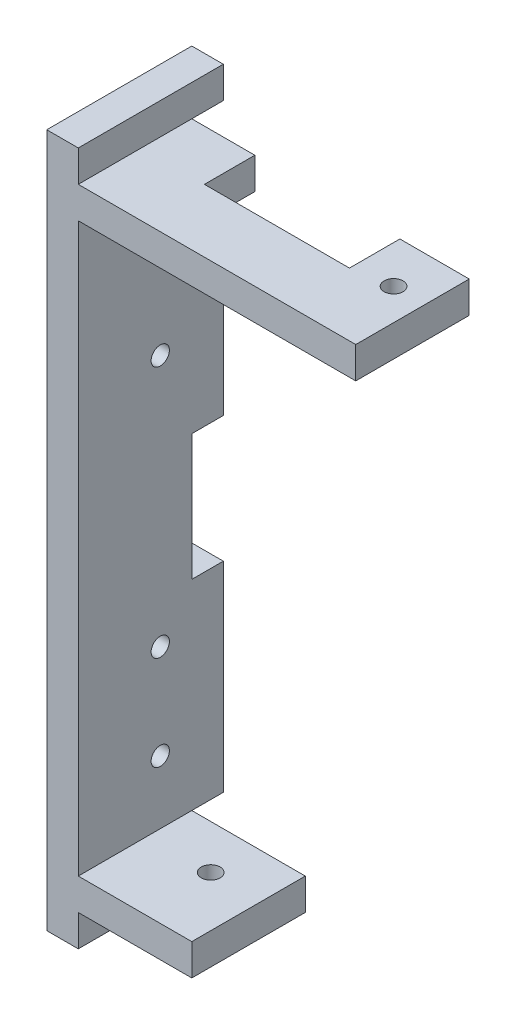
ISO-10303-21;
HEADER;
FILE_DESCRIPTION(('STEP AP214'),'2;1');
FILE_NAME('part.step','',(''),(''),'','','');
FILE_SCHEMA(('AUTOMOTIVE_DESIGN { 1 0 10303 214 1 1 1 1 }'));
ENDSEC;
DATA;
#1=APPLICATION_CONTEXT('core data for automotive mechanical design processes');
#2=APPLICATION_PROTOCOL_DEFINITION('international standard','automotive_design',2000,#1);
#3=PRODUCT_CONTEXT('',#1,'mechanical');
#4=PRODUCT('Part','Part','',(#3));
#5=PRODUCT_RELATED_PRODUCT_CATEGORY('part','',(#4));
#6=PRODUCT_DEFINITION_FORMATION('','',#4);
#7=PRODUCT_DEFINITION_CONTEXT('part definition',#1,'design');
#8=PRODUCT_DEFINITION('design','',#6,#7);
#9=PRODUCT_DEFINITION_SHAPE('','',#8);
#10=(LENGTH_UNIT() NAMED_UNIT(*) SI_UNIT(.MILLI.,.METRE.));
#11=(NAMED_UNIT(*) PLANE_ANGLE_UNIT() SI_UNIT($,.RADIAN.));
#12=(NAMED_UNIT(*) SI_UNIT($,.STERADIAN.) SOLID_ANGLE_UNIT());
#13=UNCERTAINTY_MEASURE_WITH_UNIT(LENGTH_MEASURE(1.E-05),#10,'distance_accuracy_value','');
#14=(GEOMETRIC_REPRESENTATION_CONTEXT(3) GLOBAL_UNCERTAINTY_ASSIGNED_CONTEXT((#13)) GLOBAL_UNIT_ASSIGNED_CONTEXT((#10,
#11,#12)) REPRESENTATION_CONTEXT('',''));
#15=CARTESIAN_POINT('',(0.,0.,0.));
#16=DIRECTION('',(0.,0.,1.));
#17=DIRECTION('',(1.,0.,0.));
#18=AXIS2_PLACEMENT_3D('',#15,#16,#17);
#19=CARTESIAN_POINT('',(-17.451364003671,100.30387717679,23.));
#20=DIRECTION('',(-1.,0.,0.));
#21=DIRECTION('',(0.,-1.,0.));
#22=AXIS2_PLACEMENT_3D('',#19,#20,#21);
#23=PLANE('',#22);
#24=CARTESIAN_POINT('',(-17.4513640036705,25.3038771767903,10.));
#25=DIRECTION('',(-1.,0.,0.));
#26=DIRECTION('',(0.,-1.,0.));
#27=AXIS2_PLACEMENT_3D('',#24,#25,#26);
#28=CIRCLE('',#27,1.45);
#29=CARTESIAN_POINT('',(-17.4513640036705,23.8538771767903,10.));
#30=VERTEX_POINT('',#29);
#31=EDGE_CURVE('E589',#30,#30,#28,.T.);
#32=ORIENTED_EDGE('',*,*,#31,.T.);
#33=EDGE_LOOP('',(#32));
#34=FACE_BOUND('',#33,.T.);
#35=CARTESIAN_POINT('',(-17.4513640036708,65.3038771767903,10.));
#36=DIRECTION('',(-1.,0.,0.));
#37=DIRECTION('',(0.,-1.,0.));
#38=AXIS2_PLACEMENT_3D('',#35,#36,#37);
#39=CIRCLE('',#38,1.45);
#40=CARTESIAN_POINT('',(-17.4513640036708,63.8538771767902,10.));
#41=VERTEX_POINT('',#40);
#42=EDGE_CURVE('E583',#41,#41,#39,.T.);
#43=ORIENTED_EDGE('',*,*,#42,.T.);
#44=EDGE_LOOP('',(#43));
#45=FACE_BOUND('',#44,.T.);
#46=CARTESIAN_POINT('',(-17.4513640036705,10.3038771767903,10.));
#47=DIRECTION('',(-1.,0.,0.));
#48=DIRECTION('',(0.,-1.,0.));
#49=AXIS2_PLACEMENT_3D('',#46,#47,#48);
#50=CIRCLE('',#49,1.45);
#51=CARTESIAN_POINT('',(-17.4513640036705,8.85387717679027,10.));
#52=VERTEX_POINT('',#51);
#53=EDGE_CURVE('E577',#52,#52,#50,.T.);
#54=ORIENTED_EDGE('',*,*,#53,.T.);
#55=EDGE_LOOP('',(#54));
#56=FACE_BOUND('',#55,.T.);
#57=CARTESIAN_POINT('',(-17.4513640036709,80.3038771767903,10.));
#58=DIRECTION('',(-1.,0.,0.));
#59=DIRECTION('',(0.,-1.,0.));
#60=AXIS2_PLACEMENT_3D('',#57,#58,#59);
#61=CIRCLE('',#60,1.45000000000001);
#62=CARTESIAN_POINT('',(-17.4513640036708,78.8538771767902,10.));
#63=VERTEX_POINT('',#62);
#64=EDGE_CURVE('E569',#63,#63,#61,.T.);
#65=ORIENTED_EDGE('',*,*,#64,.T.);
#66=EDGE_LOOP('',(#65));
#67=FACE_BOUND('',#66,.T.);
#68=DIRECTION('',(0.,0.,-1.));
#69=VECTOR('',#68,1.);
#70=CARTESIAN_POINT('',(-17.4513640036709,0.303877176790257,23.));
#71=LINE('',#70,#69);
#72=CARTESIAN_POINT('',(-17.4513640036709,0.303877176790257,23.));
#73=VERTEX_POINT('',#72);
#74=CARTESIAN_POINT('',(-17.451364003671,0.303877176790257,5.));
#75=VERTEX_POINT('',#74);
#76=EDGE_CURVE('E378',#73,#75,#71,.T.);
#77=ORIENTED_EDGE('',*,*,#76,.T.);
#78=DIRECTION('',(0.,0.,-1.));
#79=VECTOR('',#78,1.);
#80=CARTESIAN_POINT('',(-17.451364003671,0.303877176790253,5.));
#81=LINE('',#80,#79);
#82=CARTESIAN_POINT('',(-17.451364003671,0.303877176790253,0.));
#83=VERTEX_POINT('',#82);
#84=EDGE_CURVE('E229',#75,#83,#81,.T.);
#85=ORIENTED_EDGE('',*,*,#84,.T.);
#86=DIRECTION('',(0.,1.,0.));
#87=VECTOR('',#86,1.);
#88=CARTESIAN_POINT('',(-17.4513640036709,90.3038771767903,0.));
#89=LINE('',#88,#87);
#90=CARTESIAN_POINT('',(-17.4513640036709,32.0538771767903,0.));
#91=VERTEX_POINT('',#90);
#92=EDGE_CURVE('E356',#83,#91,#89,.T.);
#93=ORIENTED_EDGE('',*,*,#92,.T.);
#94=DIRECTION('',(0.,0.,-1.));
#95=VECTOR('',#94,1.);
#96=CARTESIAN_POINT('',(-17.4513640036709,32.0538771767903,5.));
#97=LINE('',#96,#95);
#98=CARTESIAN_POINT('',(-17.4513640036709,32.0538771767903,5.));
#99=VERTEX_POINT('',#98);
#100=EDGE_CURVE('E306',#99,#91,#97,.T.);
#101=ORIENTED_EDGE('',*,*,#100,.F.);
#102=DIRECTION('',(0.,-1.,0.));
#103=VECTOR('',#102,1.);
#104=CARTESIAN_POINT('',(-17.4513640036709,32.0538771767903,5.));
#105=LINE('',#104,#103);
#106=CARTESIAN_POINT('',(-17.4513640036709,52.0538771767903,5.));
#107=VERTEX_POINT('',#106);
#108=EDGE_CURVE('E294',#107,#99,#105,.T.);
#109=ORIENTED_EDGE('',*,*,#108,.F.);
#110=DIRECTION('',(0.,0.,-1.));
#111=VECTOR('',#110,1.);
#112=CARTESIAN_POINT('',(-17.4513640036709,52.0538771767903,5.));
#113=LINE('',#112,#111);
#114=CARTESIAN_POINT('',(-17.4513640036709,52.0538771767903,0.));
#115=VERTEX_POINT('',#114);
#116=EDGE_CURVE('E310',#107,#115,#113,.T.);
#117=ORIENTED_EDGE('',*,*,#116,.T.);
#118=DIRECTION('',(0.,1.,0.));
#119=VECTOR('',#118,1.);
#120=CARTESIAN_POINT('',(-17.451364003671,100.30387717679,0.));
#121=LINE('',#120,#119);
#122=CARTESIAN_POINT('',(-17.451364003671,90.3038771767903,0.));
#123=VERTEX_POINT('',#122);
#124=EDGE_CURVE('E359',#115,#123,#121,.T.);
#125=ORIENTED_EDGE('',*,*,#124,.T.);
#126=DIRECTION('',(0.,0.,-1.));
#127=VECTOR('',#126,1.);
#128=CARTESIAN_POINT('',(-17.451364003671,90.3038771767903,5.));
#129=LINE('',#128,#127);
#130=CARTESIAN_POINT('',(-17.451364003671,90.3038771767903,5.));
#131=VERTEX_POINT('',#130);
#132=EDGE_CURVE('E549',#131,#123,#129,.T.);
#133=ORIENTED_EDGE('',*,*,#132,.F.);
#134=DIRECTION('',(0.,0.,-1.));
#135=VECTOR('',#134,1.);
#136=CARTESIAN_POINT('',(-17.4513640036709,90.3038771767903,23.));
#137=LINE('',#136,#135);
#138=CARTESIAN_POINT('',(-17.4513640036709,90.3038771767903,23.));
#139=VERTEX_POINT('',#138);
#140=EDGE_CURVE('E376',#139,#131,#137,.T.);
#141=ORIENTED_EDGE('',*,*,#140,.F.);
#142=DIRECTION('',(0.,1.,0.));
#143=VECTOR('',#142,1.);
#144=CARTESIAN_POINT('',(-17.4513640036709,90.3038771767903,23.));
#145=LINE('',#144,#143);
#146=EDGE_CURVE('E335',#73,#139,#145,.T.);
#147=ORIENTED_EDGE('',*,*,#146,.F.);
#148=EDGE_LOOP('',(#77,#85,#93,#101,#109,#117,#125,#133,#141,#147));
#149=FACE_BOUND('',#148,.T.);
#150=ADVANCED_FACE('F33',(#34,#45,#56,#67,#149),#23,.F.);
#151=CARTESIAN_POINT('',(0.,0.,0.));
#152=DIRECTION('',(0.,0.,1.));
#153=DIRECTION('',(1.,0.,0.));
#154=AXIS2_PLACEMENT_3D('',#151,#152,#153);
#155=PLANE('',#154);
#156=ORIENTED_EDGE('',*,*,#92,.F.);
#157=DIRECTION('',(-1.,0.,0.));
#158=VECTOR('',#157,1.);
#159=CARTESIAN_POINT('',(0.,0.303877176790253,0.));
#160=LINE('',#159,#158);
#161=CARTESIAN_POINT('',(-22.4513640036709,0.303877176790253,0.));
#162=VERTEX_POINT('',#161);
#163=EDGE_CURVE('E11',#83,#162,#160,.T.);
#164=ORIENTED_EDGE('',*,*,#163,.T.);
#165=DIRECTION('',(0.,-1.,0.));
#166=VECTOR('',#165,1.);
#167=CARTESIAN_POINT('',(-22.451364003671,100.30387717679,0.));
#168=LINE('',#167,#166);
#169=CARTESIAN_POINT('',(-22.451364003671,32.0538771767903,0.));
#170=VERTEX_POINT('',#169);
#171=EDGE_CURVE('E353',#170,#162,#168,.T.);
#172=ORIENTED_EDGE('',*,*,#171,.F.);
#173=DIRECTION('',(-1.,0.,0.));
#174=VECTOR('',#173,1.);
#175=CARTESIAN_POINT('',(-17.4513640036709,32.0538771767903,0.));
#176=LINE('',#175,#174);
#177=EDGE_CURVE('E293',#91,#170,#176,.T.);
#178=ORIENTED_EDGE('',*,*,#177,.F.);
#179=EDGE_LOOP('',(#156,#164,#172,#178));
#180=FACE_BOUND('',#179,.T.);
#181=ADVANCED_FACE('F418',(#180),#155,.F.);
#182=CARTESIAN_POINT('',(-17.451364003671,95.3038771767903,0.));
#183=VERTEX_POINT('',#182);
#184=CARTESIAN_POINT('',(-17.451364003671,100.30387717679,0.));
#185=VERTEX_POINT('',#184);
#186=EDGE_CURVE('E358',#183,#185,#121,.T.);
#187=ORIENTED_EDGE('',*,*,#186,.F.);
#188=DIRECTION('',(1.,0.,0.));
#189=VECTOR('',#188,1.);
#190=CARTESIAN_POINT('',(-17.451364003671,95.3038771767903,0.));
#191=LINE('',#190,#189);
#192=CARTESIAN_POINT('',(-22.451364003671,95.3038771767903,0.));
#193=VERTEX_POINT('',#192);
#194=EDGE_CURVE('E517',#193,#183,#191,.T.);
#195=ORIENTED_EDGE('',*,*,#194,.F.);
#196=CARTESIAN_POINT('',(-22.451364003671,100.30387717679,0.));
#197=VERTEX_POINT('',#196);
#198=EDGE_CURVE('E348',#197,#193,#168,.T.);
#199=ORIENTED_EDGE('',*,*,#198,.F.);
#200=DIRECTION('',(-1.,0.,0.));
#201=VECTOR('',#200,1.);
#202=CARTESIAN_POINT('',(-22.451364003671,100.30387717679,0.));
#203=LINE('',#202,#201);
#204=EDGE_CURVE('E326',#185,#197,#203,.T.);
#205=ORIENTED_EDGE('',*,*,#204,.F.);
#206=EDGE_LOOP('',(#187,#195,#199,#205));
#207=FACE_BOUND('',#206,.T.);
#208=ADVANCED_FACE('F425',(#207),#155,.F.);
#209=DIRECTION('',(0.,0.,-1.));
#210=VECTOR('',#209,1.);
#211=CARTESIAN_POINT('',(-17.4513640036709,95.3038771767903,23.));
#212=LINE('',#211,#210);
#213=CARTESIAN_POINT('',(-17.4513640036709,95.3038771767903,23.));
#214=VERTEX_POINT('',#213);
#215=CARTESIAN_POINT('',(-17.451364003671,95.3038771767903,5.));
#216=VERTEX_POINT('',#215);
#217=EDGE_CURVE('E368',#214,#216,#212,.T.);
#218=ORIENTED_EDGE('',*,*,#217,.T.);
#219=DIRECTION('',(0.,0.,-1.));
#220=VECTOR('',#219,1.);
#221=CARTESIAN_POINT('',(-17.451364003671,95.3038771767903,5.));
#222=LINE('',#221,#220);
#223=EDGE_CURVE('E522',#216,#183,#222,.T.);
#224=ORIENTED_EDGE('',*,*,#223,.T.);
#225=ORIENTED_EDGE('',*,*,#186,.T.);
#226=DIRECTION('',(0.,0.,-1.));
#227=VECTOR('',#226,1.);
#228=CARTESIAN_POINT('',(-17.451364003671,100.30387717679,23.));
#229=LINE('',#228,#227);
#230=CARTESIAN_POINT('',(-17.451364003671,100.30387717679,23.));
#231=VERTEX_POINT('',#230);
#232=EDGE_CURVE('E365',#231,#185,#229,.T.);
#233=ORIENTED_EDGE('',*,*,#232,.F.);
#234=DIRECTION('',(0.,1.,0.));
#235=VECTOR('',#234,1.);
#236=CARTESIAN_POINT('',(-17.451364003671,100.30387717679,23.));
#237=LINE('',#236,#235);
#238=EDGE_CURVE('E343',#214,#231,#237,.T.);
#239=ORIENTED_EDGE('',*,*,#238,.F.);
#240=EDGE_LOOP('',(#218,#224,#225,#233,#239));
#241=FACE_BOUND('',#240,.T.);
#242=ADVANCED_FACE('F421',(#241),#23,.F.);
#243=CARTESIAN_POINT('',(-22.451364003671,90.3038771767903,0.));
#244=VERTEX_POINT('',#243);
#245=CARTESIAN_POINT('',(-22.451364003671,52.0538771767903,0.));
#246=VERTEX_POINT('',#245);
#247=EDGE_CURVE('E352',#244,#246,#168,.T.);
#248=ORIENTED_EDGE('',*,*,#247,.F.);
#249=DIRECTION('',(-1.,0.,0.));
#250=VECTOR('',#249,1.);
#251=CARTESIAN_POINT('',(-17.451364003671,90.3038771767903,0.));
#252=LINE('',#251,#250);
#253=EDGE_CURVE('E555',#123,#244,#252,.T.);
#254=ORIENTED_EDGE('',*,*,#253,.F.);
#255=ORIENTED_EDGE('',*,*,#124,.F.);
#256=DIRECTION('',(1.,0.,0.));
#257=VECTOR('',#256,1.);
#258=CARTESIAN_POINT('',(-17.4513640036709,52.0538771767903,0.));
#259=LINE('',#258,#257);
#260=EDGE_CURVE('E298',#246,#115,#259,.T.);
#261=ORIENTED_EDGE('',*,*,#260,.F.);
#262=EDGE_LOOP('',(#248,#254,#255,#261));
#263=FACE_BOUND('',#262,.T.);
#264=ADVANCED_FACE('F434',(#263),#155,.F.);
#265=CARTESIAN_POINT('',(-22.451364003671,100.30387717679,23.));
#266=DIRECTION('',(1.,0.,0.));
#267=DIRECTION('',(0.,1.,0.));
#268=AXIS2_PLACEMENT_3D('',#265,#266,#267);
#269=PLANE('',#268);
#270=CARTESIAN_POINT('',(-22.4513640036709,25.3038771767903,10.));
#271=DIRECTION('',(-1.,0.,0.));
#272=DIRECTION('',(0.,-1.,0.));
#273=AXIS2_PLACEMENT_3D('',#270,#271,#272);
#274=CIRCLE('',#273,1.45);
#275=CARTESIAN_POINT('',(-22.4513640036709,23.8538771767903,10.));
#276=VERTEX_POINT('',#275);
#277=EDGE_CURVE('E591',#276,#276,#274,.T.);
#278=ORIENTED_EDGE('',*,*,#277,.F.);
#279=EDGE_LOOP('',(#278));
#280=FACE_BOUND('',#279,.T.);
#281=CARTESIAN_POINT('',(-22.4513640036709,65.3038771767903,10.));
#282=DIRECTION('',(-1.,0.,0.));
#283=DIRECTION('',(0.,-1.,0.));
#284=AXIS2_PLACEMENT_3D('',#281,#282,#283);
#285=CIRCLE('',#284,1.45);
#286=CARTESIAN_POINT('',(-22.4513640036709,63.8538771767902,10.));
#287=VERTEX_POINT('',#286);
#288=EDGE_CURVE('E586',#287,#287,#285,.T.);
#289=ORIENTED_EDGE('',*,*,#288,.F.);
#290=EDGE_LOOP('',(#289));
#291=FACE_BOUND('',#290,.T.);
#292=CARTESIAN_POINT('',(-22.4513640036709,10.3038771767903,10.));
#293=DIRECTION('',(-1.,0.,0.));
#294=DIRECTION('',(0.,-1.,0.));
#295=AXIS2_PLACEMENT_3D('',#292,#293,#294);
#296=CIRCLE('',#295,1.45);
#297=CARTESIAN_POINT('',(-22.4513640036709,8.85387717679026,10.));
#298=VERTEX_POINT('',#297);
#299=EDGE_CURVE('E580',#298,#298,#296,.T.);
#300=ORIENTED_EDGE('',*,*,#299,.F.);
#301=EDGE_LOOP('',(#300));
#302=FACE_BOUND('',#301,.T.);
#303=CARTESIAN_POINT('',(-22.451364003671,80.3038771767903,10.));
#304=DIRECTION('',(-1.,0.,0.));
#305=DIRECTION('',(0.,-1.,0.));
#306=AXIS2_PLACEMENT_3D('',#303,#304,#305);
#307=CIRCLE('',#306,1.45000000000001);
#308=CARTESIAN_POINT('',(-22.451364003671,78.8538771767902,10.));
#309=VERTEX_POINT('',#308);
#310=EDGE_CURVE('E574',#309,#309,#307,.T.);
#311=ORIENTED_EDGE('',*,*,#310,.F.);
#312=EDGE_LOOP('',(#311));
#313=FACE_BOUND('',#312,.T.);
#314=ORIENTED_EDGE('',*,*,#171,.T.);
#315=DIRECTION('',(0.,0.,1.));
#316=VECTOR('',#315,1.);
#317=CARTESIAN_POINT('',(-22.4513640036709,0.303877176790257,23.));
#318=LINE('',#317,#316);
#319=CARTESIAN_POINT('',(-22.4513640036709,0.303877176790253,5.));
#320=VERTEX_POINT('',#319);
#321=EDGE_CURVE('E562',#162,#320,#318,.T.);
#322=ORIENTED_EDGE('',*,*,#321,.T.);
#323=DIRECTION('',(0.,-1.,0.));
#324=VECTOR('',#323,1.);
#325=CARTESIAN_POINT('',(-22.451364003671,100.30387717679,5.));
#326=LINE('',#325,#324);
#327=CARTESIAN_POINT('',(-22.4513640036709,-4.69612282320975,5.));
#328=VERTEX_POINT('',#327);
#329=EDGE_CURVE('E557',#320,#328,#326,.T.);
#330=ORIENTED_EDGE('',*,*,#329,.T.);
#331=DIRECTION('',(0.,0.,-1.));
#332=VECTOR('',#331,1.);
#333=CARTESIAN_POINT('',(-22.4513640036709,-4.69612282320975,23.));
#334=LINE('',#333,#332);
#335=CARTESIAN_POINT('',(-22.4513640036709,-4.69612282320975,0.));
#336=VERTEX_POINT('',#335);
#337=EDGE_CURVE('E212',#328,#336,#334,.T.);
#338=ORIENTED_EDGE('',*,*,#337,.T.);
#339=CARTESIAN_POINT('',(-22.4513640036709,-9.69612282320974,0.));
#340=VERTEX_POINT('',#339);
#341=EDGE_CURVE('E313',#336,#340,#168,.T.);
#342=ORIENTED_EDGE('',*,*,#341,.T.);
#343=DIRECTION('',(0.,0.,-1.));
#344=VECTOR('',#343,1.);
#345=CARTESIAN_POINT('',(-22.4513640036709,-9.69612282320974,23.));
#346=LINE('',#345,#344);
#347=CARTESIAN_POINT('',(-22.4513640036709,-9.69612282320974,23.));
#348=VERTEX_POINT('',#347);
#349=EDGE_CURVE('E246',#348,#340,#346,.T.);
#350=ORIENTED_EDGE('',*,*,#349,.F.);
#351=DIRECTION('',(0.,-1.,0.));
#352=VECTOR('',#351,1.);
#353=CARTESIAN_POINT('',(-22.451364003671,100.30387717679,23.));
#354=LINE('',#353,#352);
#355=CARTESIAN_POINT('',(-22.451364003671,100.30387717679,23.));
#356=VERTEX_POINT('',#355);
#357=EDGE_CURVE('E322',#356,#348,#354,.T.);
#358=ORIENTED_EDGE('',*,*,#357,.F.);
#359=DIRECTION('',(0.,0.,-1.));
#360=VECTOR('',#359,1.);
#361=CARTESIAN_POINT('',(-22.451364003671,100.30387717679,23.));
#362=LINE('',#361,#360);
#363=EDGE_CURVE('E347',#356,#197,#362,.T.);
#364=ORIENTED_EDGE('',*,*,#363,.T.);
#365=ORIENTED_EDGE('',*,*,#198,.T.);
#366=DIRECTION('',(0.,0.,1.));
#367=VECTOR('',#366,1.);
#368=CARTESIAN_POINT('',(-22.451364003671,95.3038771767903,23.));
#369=LINE('',#368,#367);
#370=CARTESIAN_POINT('',(-22.451364003671,95.3038771767903,5.));
#371=VERTEX_POINT('',#370);
#372=EDGE_CURVE('E538',#193,#371,#369,.T.);
#373=ORIENTED_EDGE('',*,*,#372,.T.);
#374=DIRECTION('',(0.,1.,0.));
#375=VECTOR('',#374,1.);
#376=CARTESIAN_POINT('',(-22.451364003671,100.30387717679,5.));
#377=LINE('',#376,#375);
#378=CARTESIAN_POINT('',(-22.451364003671,90.3038771767903,5.));
#379=VERTEX_POINT('',#378);
#380=EDGE_CURVE('E545',#379,#371,#377,.T.);
#381=ORIENTED_EDGE('',*,*,#380,.F.);
#382=DIRECTION('',(0.,0.,-1.));
#383=VECTOR('',#382,1.);
#384=CARTESIAN_POINT('',(-22.451364003671,90.3038771767903,23.));
#385=LINE('',#384,#383);
#386=EDGE_CURVE('E541',#379,#244,#385,.T.);
#387=ORIENTED_EDGE('',*,*,#386,.T.);
#388=ORIENTED_EDGE('',*,*,#247,.T.);
#389=DIRECTION('',(0.,0.,-1.));
#390=VECTOR('',#389,1.);
#391=CARTESIAN_POINT('',(-22.451364003671,52.0538771767903,5.));
#392=LINE('',#391,#390);
#393=CARTESIAN_POINT('',(-22.451364003671,52.0538771767903,5.));
#394=VERTEX_POINT('',#393);
#395=EDGE_CURVE('E314',#394,#246,#392,.T.);
#396=ORIENTED_EDGE('',*,*,#395,.F.);
#397=DIRECTION('',(0.,1.,0.));
#398=VECTOR('',#397,1.);
#399=CARTESIAN_POINT('',(-22.451364003671,32.0538771767903,5.));
#400=LINE('',#399,#398);
#401=CARTESIAN_POINT('',(-22.451364003671,32.0538771767903,5.));
#402=VERTEX_POINT('',#401);
#403=EDGE_CURVE('E301',#402,#394,#400,.T.);
#404=ORIENTED_EDGE('',*,*,#403,.F.);
#405=DIRECTION('',(0.,0.,-1.));
#406=VECTOR('',#405,1.);
#407=CARTESIAN_POINT('',(-22.451364003671,32.0538771767903,5.));
#408=LINE('',#407,#406);
#409=EDGE_CURVE('E317',#402,#170,#408,.T.);
#410=ORIENTED_EDGE('',*,*,#409,.T.);
#411=EDGE_LOOP('',(#314,#322,#330,#338,#342,#350,#358,#364,#365,#373,#381,#387,#388,#396,#404,#410));
#412=FACE_BOUND('',#411,.T.);
#413=ADVANCED_FACE('F35',(#280,#291,#302,#313,#412),#269,.F.);
#414=CARTESIAN_POINT('',(-22.4513640036709,-9.69612282320974,23.));
#415=DIRECTION('',(0.,1.,0.));
#416=DIRECTION('',(-1.,0.,0.));
#417=AXIS2_PLACEMENT_3D('',#414,#415,#416);
#418=PLANE('',#417);
#419=DIRECTION('',(1.,0.,0.));
#420=VECTOR('',#419,1.);
#421=CARTESIAN_POINT('',(-22.4513640036709,-9.69612282320974,0.));
#422=LINE('',#421,#420);
#423=CARTESIAN_POINT('',(-17.4513640036709,-9.69612282320974,0.));
#424=VERTEX_POINT('',#423);
#425=EDGE_CURVE('E351',#340,#424,#422,.T.);
#426=ORIENTED_EDGE('',*,*,#425,.T.);
#427=DIRECTION('',(0.,0.,-1.));
#428=VECTOR('',#427,1.);
#429=CARTESIAN_POINT('',(-17.4513640036709,-9.69612282320974,23.));
#430=LINE('',#429,#428);
#431=CARTESIAN_POINT('',(-17.4513640036709,-9.69612282320974,23.));
#432=VERTEX_POINT('',#431);
#433=EDGE_CURVE('E243',#432,#424,#430,.T.);
#434=ORIENTED_EDGE('',*,*,#433,.F.);
#435=DIRECTION('',(1.,0.,0.));
#436=VECTOR('',#435,1.);
#437=CARTESIAN_POINT('',(-22.4513640036709,-9.69612282320974,23.));
#438=LINE('',#437,#436);
#439=EDGE_CURVE('E325',#348,#432,#438,.T.);
#440=ORIENTED_EDGE('',*,*,#439,.F.);
#441=ORIENTED_EDGE('',*,*,#349,.T.);
#442=EDGE_LOOP('',(#426,#434,#440,#441));
#443=FACE_BOUND('',#442,.T.);
#444=ADVANCED_FACE('F409',(#443),#418,.F.);
#445=CARTESIAN_POINT('',(-17.4513640036709,-4.69612282320974,23.));
#446=DIRECTION('',(0.,1.,0.));
#447=DIRECTION('',(0.,0.,1.));
#448=AXIS2_PLACEMENT_3D('',#445,#446,#447);
#449=PLANE('',#448);
#450=CARTESIAN_POINT('',(-7.45136400367091,-4.69612282320974,12.));
#451=DIRECTION('',(0.,-1.,0.));
#452=DIRECTION('',(1.,0.,0.));
#453=AXIS2_PLACEMENT_3D('',#450,#451,#452);
#454=CIRCLE('',#453,1.5);
#455=CARTESIAN_POINT('',(-5.95136400367091,-4.69612282320974,12.));
#456=VERTEX_POINT('',#455);
#457=EDGE_CURVE('E278',#456,#456,#454,.T.);
#458=ORIENTED_EDGE('',*,*,#457,.F.);
#459=EDGE_LOOP('',(#458));
#460=FACE_BOUND('',#459,.T.);
#461=DIRECTION('',(0.,0.,-1.));
#462=VECTOR('',#461,1.);
#463=CARTESIAN_POINT('',(-17.4513640036709,-4.69612282320974,23.));
#464=LINE('',#463,#462);
#465=CARTESIAN_POINT('',(-17.4513640036709,-4.69612282320974,23.));
#466=VERTEX_POINT('',#465);
#467=CARTESIAN_POINT('',(-17.451364003671,-4.69612282320975,5.));
#468=VERTEX_POINT('',#467);
#469=EDGE_CURVE('E225',#466,#468,#464,.T.);
#470=ORIENTED_EDGE('',*,*,#469,.T.);
#471=DIRECTION('',(1.,0.,0.));
#472=VECTOR('',#471,1.);
#473=CARTESIAN_POINT('',(-17.4513640036709,-4.69612282320974,5.));
#474=LINE('',#473,#472);
#475=CARTESIAN_POINT('',(0.548635996329077,-4.69612282320974,5.));
#476=VERTEX_POINT('',#475);
#477=EDGE_CURVE('E232',#468,#476,#474,.T.);
#478=ORIENTED_EDGE('',*,*,#477,.T.);
#479=DIRECTION('',(0.,0.,-1.));
#480=VECTOR('',#479,1.);
#481=CARTESIAN_POINT('',(0.548635996329077,-4.69612282320974,23.));
#482=LINE('',#481,#480);
#483=CARTESIAN_POINT('',(0.548635996329077,-4.69612282320974,23.));
#484=VERTEX_POINT('',#483);
#485=EDGE_CURVE('E244',#484,#476,#482,.T.);
#486=ORIENTED_EDGE('',*,*,#485,.F.);
#487=DIRECTION('',(1.,0.,0.));
#488=VECTOR('',#487,1.);
#489=CARTESIAN_POINT('',(-17.4513640036709,-4.69612282320974,23.));
#490=LINE('',#489,#488);
#491=EDGE_CURVE('E242',#466,#484,#490,.T.);
#492=ORIENTED_EDGE('',*,*,#491,.F.);
#493=EDGE_LOOP('',(#470,#478,#486,#492));
#494=FACE_BOUND('',#493,.T.);
#495=ADVANCED_FACE('F241',(#460,#494),#449,.F.);
#496=CARTESIAN_POINT('',(0.548635996329077,-4.69612282320974,23.));
#497=DIRECTION('',(-1.,0.,0.));
#498=DIRECTION('',(0.,0.,1.));
#499=AXIS2_PLACEMENT_3D('',#496,#497,#498);
#500=PLANE('',#499);
#501=ORIENTED_EDGE('',*,*,#485,.T.);
#502=DIRECTION('',(0.,1.,0.));
#503=VECTOR('',#502,1.);
#504=CARTESIAN_POINT('',(0.548635996329077,-4.69612282320974,5.));
#505=LINE('',#504,#503);
#506=CARTESIAN_POINT('',(0.548635996329077,0.303877176790257,5.));
#507=VERTEX_POINT('',#506);
#508=EDGE_CURVE('E235',#476,#507,#505,.T.);
#509=ORIENTED_EDGE('',*,*,#508,.T.);
#510=DIRECTION('',(0.,0.,-1.));
#511=VECTOR('',#510,1.);
#512=CARTESIAN_POINT('',(0.548635996329077,0.303877176790257,23.));
#513=LINE('',#512,#511);
#514=CARTESIAN_POINT('',(0.548635996329077,0.303877176790257,23.));
#515=VERTEX_POINT('',#514);
#516=EDGE_CURVE('E248',#515,#507,#513,.T.);
#517=ORIENTED_EDGE('',*,*,#516,.F.);
#518=DIRECTION('',(0.,1.,0.));
#519=VECTOR('',#518,1.);
#520=CARTESIAN_POINT('',(0.548635996329077,-4.69612282320974,23.));
#521=LINE('',#520,#519);
#522=EDGE_CURVE('E331',#484,#515,#521,.T.);
#523=ORIENTED_EDGE('',*,*,#522,.F.);
#524=EDGE_LOOP('',(#501,#509,#517,#523));
#525=FACE_BOUND('',#524,.T.);
#526=ADVANCED_FACE('F390',(#525),#500,.F.);
#527=CARTESIAN_POINT('',(-17.4513640036709,0.303877176790257,23.));
#528=DIRECTION('',(0.,-1.,0.));
#529=DIRECTION('',(0.,0.,-1.));
#530=AXIS2_PLACEMENT_3D('',#527,#528,#529);
#531=PLANE('',#530);
#532=CARTESIAN_POINT('',(-7.45136400367091,0.303877176790257,12.));
#533=DIRECTION('',(0.,-1.,0.));
#534=DIRECTION('',(0.,0.,-1.));
#535=AXIS2_PLACEMENT_3D('',#532,#533,#534);
#536=CIRCLE('',#535,1.5);
#537=CARTESIAN_POINT('',(-7.45136400367091,0.303877176790257,10.5));
#538=VERTEX_POINT('',#537);
#539=EDGE_CURVE('E272',#538,#538,#536,.F.);
#540=ORIENTED_EDGE('',*,*,#539,.F.);
#541=EDGE_LOOP('',(#540));
#542=FACE_BOUND('',#541,.T.);
#543=ORIENTED_EDGE('',*,*,#516,.T.);
#544=DIRECTION('',(-1.,0.,0.));
#545=VECTOR('',#544,1.);
#546=CARTESIAN_POINT('',(-17.4513640036709,0.303877176790257,5.));
#547=LINE('',#546,#545);
#548=EDGE_CURVE('E387',#507,#75,#547,.T.);
#549=ORIENTED_EDGE('',*,*,#548,.T.);
#550=ORIENTED_EDGE('',*,*,#76,.F.);
#551=DIRECTION('',(-1.,0.,0.));
#552=VECTOR('',#551,1.);
#553=CARTESIAN_POINT('',(-17.4513640036709,0.303877176790257,23.));
#554=LINE('',#553,#552);
#555=EDGE_CURVE('E333',#515,#73,#554,.T.);
#556=ORIENTED_EDGE('',*,*,#555,.F.);
#557=EDGE_LOOP('',(#543,#549,#550,#556));
#558=FACE_BOUND('',#557,.T.);
#559=ADVANCED_FACE('F385',(#542,#558),#531,.F.);
#560=CARTESIAN_POINT('',(-17.4513640036709,90.3038771767903,23.));
#561=DIRECTION('',(0.,1.,0.));
#562=DIRECTION('',(0.,0.,1.));
#563=AXIS2_PLACEMENT_3D('',#560,#561,#562);
#564=PLANE('',#563);
#565=CARTESIAN_POINT('',(21.5486359963291,90.3038771767903,12.));
#566=DIRECTION('',(0.,1.,0.));
#567=DIRECTION('',(0.,0.,1.));
#568=AXIS2_PLACEMENT_3D('',#565,#566,#567);
#569=CIRCLE('',#568,1.5);
#570=CARTESIAN_POINT('',(21.5486359963291,90.3038771767903,13.5));
#571=VERTEX_POINT('',#570);
#572=EDGE_CURVE('E398',#571,#571,#569,.T.);
#573=ORIENTED_EDGE('',*,*,#572,.T.);
#574=EDGE_LOOP('',(#573));
#575=FACE_BOUND('',#574,.T.);
#576=ORIENTED_EDGE('',*,*,#140,.T.);
#577=DIRECTION('',(1.,0.,0.));
#578=VECTOR('',#577,1.);
#579=CARTESIAN_POINT('',(-17.4513640036709,90.3038771767903,5.));
#580=LINE('',#579,#578);
#581=CARTESIAN_POINT('',(-7.45136400367093,90.3038771767903,5.));
#582=VERTEX_POINT('',#581);
#583=EDGE_CURVE('E392',#131,#582,#580,.T.);
#584=ORIENTED_EDGE('',*,*,#583,.T.);
#585=DIRECTION('',(0.,0.,-1.));
#586=VECTOR('',#585,1.);
#587=CARTESIAN_POINT('',(-7.45136400367093,90.3038771767903,0.));
#588=LINE('',#587,#586);
#589=CARTESIAN_POINT('',(-7.45136400367093,90.3038771767903,13.));
#590=VERTEX_POINT('',#589);
#591=EDGE_CURVE('E271',#590,#582,#588,.T.);
#592=ORIENTED_EDGE('',*,*,#591,.F.);
#593=DIRECTION('',(-1.,0.,0.));
#594=VECTOR('',#593,1.);
#595=CARTESIAN_POINT('',(-7.45136400367093,90.3038771767903,13.));
#596=LINE('',#595,#594);
#597=CARTESIAN_POINT('',(15.5486359963291,90.3038771767903,13.));
#598=VERTEX_POINT('',#597);
#599=EDGE_CURVE('E270',#598,#590,#596,.T.);
#600=ORIENTED_EDGE('',*,*,#599,.F.);
#601=DIRECTION('',(0.,0.,1.));
#602=VECTOR('',#601,1.);
#603=CARTESIAN_POINT('',(15.5486359963291,90.3038771767903,0.));
#604=LINE('',#603,#602);
#605=CARTESIAN_POINT('',(15.5486359963291,90.3038771767903,5.));
#606=VERTEX_POINT('',#605);
#607=EDGE_CURVE('E257',#606,#598,#604,.T.);
#608=ORIENTED_EDGE('',*,*,#607,.F.);
#609=CARTESIAN_POINT('',(26.5486359963291,90.3038771767903,5.));
#610=VERTEX_POINT('',#609);
#611=EDGE_CURVE('E56',#606,#610,#580,.T.);
#612=ORIENTED_EDGE('',*,*,#611,.T.);
#613=DIRECTION('',(0.,0.,-1.));
#614=VECTOR('',#613,1.);
#615=CARTESIAN_POINT('',(26.5486359963291,90.3038771767903,23.));
#616=LINE('',#615,#614);
#617=CARTESIAN_POINT('',(26.5486359963291,90.3038771767903,23.));
#618=VERTEX_POINT('',#617);
#619=EDGE_CURVE('E374',#618,#610,#616,.T.);
#620=ORIENTED_EDGE('',*,*,#619,.F.);
#621=DIRECTION('',(1.,0.,0.));
#622=VECTOR('',#621,1.);
#623=CARTESIAN_POINT('',(-17.4513640036709,90.3038771767903,23.));
#624=LINE('',#623,#622);
#625=EDGE_CURVE('E337',#139,#618,#624,.T.);
#626=ORIENTED_EDGE('',*,*,#625,.F.);
#627=EDGE_LOOP('',(#576,#584,#592,#600,#608,#612,#620,#626));
#628=FACE_BOUND('',#627,.T.);
#629=ADVANCED_FACE('F265',(#575,#628),#564,.F.);
#630=CARTESIAN_POINT('',(26.5486359963291,95.3038771767903,23.));
#631=DIRECTION('',(-1.,0.,0.));
#632=DIRECTION('',(0.,-1.,0.));
#633=AXIS2_PLACEMENT_3D('',#630,#631,#632);
#634=PLANE('',#633);
#635=ORIENTED_EDGE('',*,*,#619,.T.);
#636=DIRECTION('',(0.,1.,0.));
#637=VECTOR('',#636,1.);
#638=CARTESIAN_POINT('',(26.5486359963291,95.3038771767903,5.));
#639=LINE('',#638,#637);
#640=CARTESIAN_POINT('',(26.5486359963291,95.3038771767903,5.));
#641=VERTEX_POINT('',#640);
#642=EDGE_CURVE('E537',#610,#641,#639,.T.);
#643=ORIENTED_EDGE('',*,*,#642,.T.);
#644=DIRECTION('',(0.,0.,-1.));
#645=VECTOR('',#644,1.);
#646=CARTESIAN_POINT('',(26.5486359963291,95.3038771767903,23.));
#647=LINE('',#646,#645);
#648=CARTESIAN_POINT('',(26.5486359963291,95.3038771767903,23.));
#649=VERTEX_POINT('',#648);
#650=EDGE_CURVE('E371',#649,#641,#647,.T.);
#651=ORIENTED_EDGE('',*,*,#650,.F.);
#652=DIRECTION('',(0.,1.,0.));
#653=VECTOR('',#652,1.);
#654=CARTESIAN_POINT('',(26.5486359963291,95.3038771767903,23.));
#655=LINE('',#654,#653);
#656=EDGE_CURVE('E339',#618,#649,#655,.T.);
#657=ORIENTED_EDGE('',*,*,#656,.F.);
#658=EDGE_LOOP('',(#635,#643,#651,#657));
#659=FACE_BOUND('',#658,.T.);
#660=ADVANCED_FACE('F445',(#659),#634,.F.);
#661=CARTESIAN_POINT('',(-17.4513640036709,95.3038771767903,23.));
#662=DIRECTION('',(0.,-1.,0.));
#663=DIRECTION('',(0.,0.,-1.));
#664=AXIS2_PLACEMENT_3D('',#661,#662,#663);
#665=PLANE('',#664);
#666=CARTESIAN_POINT('',(21.5486359963291,95.3038771767903,12.));
#667=DIRECTION('',(0.,1.,0.));
#668=DIRECTION('',(0.,0.,1.));
#669=AXIS2_PLACEMENT_3D('',#666,#667,#668);
#670=CIRCLE('',#669,1.5);
#671=CARTESIAN_POINT('',(21.5486359963291,95.3038771767903,13.5));
#672=VERTEX_POINT('',#671);
#673=EDGE_CURVE('E239',#672,#672,#670,.T.);
#674=ORIENTED_EDGE('',*,*,#673,.F.);
#675=EDGE_LOOP('',(#674));
#676=FACE_BOUND('',#675,.T.);
#677=ORIENTED_EDGE('',*,*,#650,.T.);
#678=DIRECTION('',(-1.,0.,0.));
#679=VECTOR('',#678,1.);
#680=CARTESIAN_POINT('',(-17.4513640036709,95.3038771767903,5.));
#681=LINE('',#680,#679);
#682=CARTESIAN_POINT('',(15.5486359963291,95.3038771767903,5.));
#683=VERTEX_POINT('',#682);
#684=EDGE_CURVE('E532',#641,#683,#681,.T.);
#685=ORIENTED_EDGE('',*,*,#684,.T.);
#686=DIRECTION('',(0.,0.,-1.));
#687=VECTOR('',#686,1.);
#688=CARTESIAN_POINT('',(15.5486359963291,95.3038771767903,0.));
#689=LINE('',#688,#687);
#690=CARTESIAN_POINT('',(15.5486359963291,95.3038771767903,13.));
#691=VERTEX_POINT('',#690);
#692=EDGE_CURVE('E260',#691,#683,#689,.T.);
#693=ORIENTED_EDGE('',*,*,#692,.F.);
#694=DIRECTION('',(1.,0.,0.));
#695=VECTOR('',#694,1.);
#696=CARTESIAN_POINT('',(-7.45136400367093,95.3038771767903,13.));
#697=LINE('',#696,#695);
#698=CARTESIAN_POINT('',(-7.45136400367093,95.3038771767903,13.));
#699=VERTEX_POINT('',#698);
#700=EDGE_CURVE('E283',#699,#691,#697,.T.);
#701=ORIENTED_EDGE('',*,*,#700,.F.);
#702=DIRECTION('',(0.,0.,1.));
#703=VECTOR('',#702,1.);
#704=CARTESIAN_POINT('',(-7.45136400367093,95.3038771767903,0.));
#705=LINE('',#704,#703);
#706=CARTESIAN_POINT('',(-7.45136400367093,95.3038771767903,5.));
#707=VERTEX_POINT('',#706);
#708=EDGE_CURVE('E275',#707,#699,#705,.T.);
#709=ORIENTED_EDGE('',*,*,#708,.F.);
#710=EDGE_CURVE('E48',#707,#216,#681,.T.);
#711=ORIENTED_EDGE('',*,*,#710,.T.);
#712=ORIENTED_EDGE('',*,*,#217,.F.);
#713=DIRECTION('',(-1.,0.,0.));
#714=VECTOR('',#713,1.);
#715=CARTESIAN_POINT('',(-17.4513640036709,95.3038771767903,23.));
#716=LINE('',#715,#714);
#717=EDGE_CURVE('E341',#649,#214,#716,.T.);
#718=ORIENTED_EDGE('',*,*,#717,.F.);
#719=EDGE_LOOP('',(#677,#685,#693,#701,#709,#711,#712,#718));
#720=FACE_BOUND('',#719,.T.);
#721=ADVANCED_FACE('F438',(#676,#720),#665,.F.);
#722=CARTESIAN_POINT('',(-17.451364003671,-4.69612282320975,0.));
#723=VERTEX_POINT('',#722);
#724=EDGE_CURVE('E228',#424,#723,#89,.T.);
#725=ORIENTED_EDGE('',*,*,#724,.T.);
#726=DIRECTION('',(0.,0.,-1.));
#727=VECTOR('',#726,1.);
#728=CARTESIAN_POINT('',(-17.451364003671,-4.69612282320975,5.));
#729=LINE('',#728,#727);
#730=EDGE_CURVE('E209',#468,#723,#729,.T.);
#731=ORIENTED_EDGE('',*,*,#730,.F.);
#732=ORIENTED_EDGE('',*,*,#469,.F.);
#733=DIRECTION('',(0.,1.,0.));
#734=VECTOR('',#733,1.);
#735=CARTESIAN_POINT('',(-17.4513640036709,-4.69612282320974,23.));
#736=LINE('',#735,#734);
#737=EDGE_CURVE('E328',#432,#466,#736,.T.);
#738=ORIENTED_EDGE('',*,*,#737,.F.);
#739=ORIENTED_EDGE('',*,*,#433,.T.);
#740=EDGE_LOOP('',(#725,#731,#732,#738,#739));
#741=FACE_BOUND('',#740,.T.);
#742=ADVANCED_FACE('F222',(#741),#23,.F.);
#743=CARTESIAN_POINT('',(-22.451364003671,100.30387717679,23.));
#744=DIRECTION('',(0.,-1.,0.));
#745=DIRECTION('',(0.,0.,-1.));
#746=AXIS2_PLACEMENT_3D('',#743,#744,#745);
#747=PLANE('',#746);
#748=ORIENTED_EDGE('',*,*,#204,.T.);
#749=ORIENTED_EDGE('',*,*,#363,.F.);
#750=DIRECTION('',(-1.,0.,0.));
#751=VECTOR('',#750,1.);
#752=CARTESIAN_POINT('',(-22.451364003671,100.30387717679,23.));
#753=LINE('',#752,#751);
#754=EDGE_CURVE('E345',#231,#356,#753,.T.);
#755=ORIENTED_EDGE('',*,*,#754,.F.);
#756=ORIENTED_EDGE('',*,*,#232,.T.);
#757=EDGE_LOOP('',(#748,#749,#755,#756));
#758=FACE_BOUND('',#757,.T.);
#759=ADVANCED_FACE('F437',(#758),#747,.F.);
#760=CARTESIAN_POINT('',(0.,0.,23.));
#761=DIRECTION('',(0.,0.,1.));
#762=DIRECTION('',(1.,0.,0.));
#763=AXIS2_PLACEMENT_3D('',#760,#761,#762);
#764=PLANE('',#763);
#765=ORIENTED_EDGE('',*,*,#357,.T.);
#766=ORIENTED_EDGE('',*,*,#439,.T.);
#767=ORIENTED_EDGE('',*,*,#737,.T.);
#768=ORIENTED_EDGE('',*,*,#491,.T.);
#769=ORIENTED_EDGE('',*,*,#522,.T.);
#770=ORIENTED_EDGE('',*,*,#555,.T.);
#771=ORIENTED_EDGE('',*,*,#146,.T.);
#772=ORIENTED_EDGE('',*,*,#625,.T.);
#773=ORIENTED_EDGE('',*,*,#656,.T.);
#774=ORIENTED_EDGE('',*,*,#717,.T.);
#775=ORIENTED_EDGE('',*,*,#238,.T.);
#776=ORIENTED_EDGE('',*,*,#754,.T.);
#777=EDGE_LOOP('',(#765,#766,#767,#768,#769,#770,#771,#772,#773,#774,#775,#776));
#778=FACE_BOUND('',#777,.T.);
#779=ADVANCED_FACE('F443',(#778),#764,.T.);
#780=ORIENTED_EDGE('',*,*,#341,.F.);
#781=DIRECTION('',(-1.,0.,0.));
#782=VECTOR('',#781,1.);
#783=CARTESIAN_POINT('',(-17.451364003671,-4.69612282320975,0.));
#784=LINE('',#783,#782);
#785=EDGE_CURVE('E217',#723,#336,#784,.T.);
#786=ORIENTED_EDGE('',*,*,#785,.F.);
#787=ORIENTED_EDGE('',*,*,#724,.F.);
#788=ORIENTED_EDGE('',*,*,#425,.F.);
#789=EDGE_LOOP('',(#780,#786,#787,#788));
#790=FACE_BOUND('',#789,.T.);
#791=ADVANCED_FACE('F428',(#790),#155,.F.);
#792=CARTESIAN_POINT('',(-17.4513640036709,52.0538771767903,5.));
#793=DIRECTION('',(0.,1.,0.));
#794=DIRECTION('',(0.,0.,1.));
#795=AXIS2_PLACEMENT_3D('',#792,#793,#794);
#796=PLANE('',#795);
#797=ORIENTED_EDGE('',*,*,#260,.T.);
#798=ORIENTED_EDGE('',*,*,#116,.F.);
#799=DIRECTION('',(1.,0.,0.));
#800=VECTOR('',#799,1.);
#801=CARTESIAN_POINT('',(-17.4513640036709,52.0538771767903,5.));
#802=LINE('',#801,#800);
#803=EDGE_CURVE('E303',#394,#107,#802,.T.);
#804=ORIENTED_EDGE('',*,*,#803,.F.);
#805=ORIENTED_EDGE('',*,*,#395,.T.);
#806=EDGE_LOOP('',(#797,#798,#804,#805));
#807=FACE_BOUND('',#806,.T.);
#808=ADVANCED_FACE('F488',(#807),#796,.F.);
#809=CARTESIAN_POINT('',(-17.4513640036709,32.0538771767903,5.));
#810=DIRECTION('',(0.,-1.,0.));
#811=DIRECTION('',(0.,0.,-1.));
#812=AXIS2_PLACEMENT_3D('',#809,#810,#811);
#813=PLANE('',#812);
#814=ORIENTED_EDGE('',*,*,#177,.T.);
#815=ORIENTED_EDGE('',*,*,#409,.F.);
#816=DIRECTION('',(-1.,0.,0.));
#817=VECTOR('',#816,1.);
#818=CARTESIAN_POINT('',(-17.4513640036709,32.0538771767903,5.));
#819=LINE('',#818,#817);
#820=EDGE_CURVE('E297',#99,#402,#819,.T.);
#821=ORIENTED_EDGE('',*,*,#820,.F.);
#822=ORIENTED_EDGE('',*,*,#100,.T.);
#823=EDGE_LOOP('',(#814,#815,#821,#822));
#824=FACE_BOUND('',#823,.T.);
#825=ADVANCED_FACE('F486',(#824),#813,.F.);
#826=CARTESIAN_POINT('',(0.,0.,5.));
#827=DIRECTION('',(0.,0.,1.));
#828=DIRECTION('',(1.,0.,0.));
#829=AXIS2_PLACEMENT_3D('',#826,#827,#828);
#830=PLANE('',#829);
#831=ORIENTED_EDGE('',*,*,#108,.T.);
#832=ORIENTED_EDGE('',*,*,#820,.T.);
#833=ORIENTED_EDGE('',*,*,#403,.T.);
#834=ORIENTED_EDGE('',*,*,#803,.T.);
#835=EDGE_LOOP('',(#831,#832,#833,#834));
#836=FACE_BOUND('',#835,.T.);
#837=ADVANCED_FACE('F482',(#836),#830,.F.);
#838=CARTESIAN_POINT('',(-7.45136400367093,-9.69712282320974,0.));
#839=DIRECTION('',(-1.,0.,0.));
#840=DIRECTION('',(0.,0.,1.));
#841=AXIS2_PLACEMENT_3D('',#838,#839,#840);
#842=PLANE('',#841);
#843=ORIENTED_EDGE('',*,*,#591,.T.);
#844=DIRECTION('',(0.,1.,0.));
#845=VECTOR('',#844,1.);
#846=CARTESIAN_POINT('',(-7.45136400367093,-9.69712282320974,5.));
#847=LINE('',#846,#845);
#848=EDGE_CURVE('E530',#582,#707,#847,.T.);
#849=ORIENTED_EDGE('',*,*,#848,.T.);
#850=ORIENTED_EDGE('',*,*,#708,.T.);
#851=DIRECTION('',(0.,1.,0.));
#852=VECTOR('',#851,1.);
#853=CARTESIAN_POINT('',(-7.45136400367093,-9.69712282320974,13.));
#854=LINE('',#853,#852);
#855=EDGE_CURVE('E287',#590,#699,#854,.T.);
#856=ORIENTED_EDGE('',*,*,#855,.F.);
#857=EDGE_LOOP('',(#843,#849,#850,#856));
#858=FACE_BOUND('',#857,.T.);
#859=ADVANCED_FACE('F478',(#858),#842,.F.);
#860=CARTESIAN_POINT('',(15.5486359963291,-9.69712282320974,0.));
#861=DIRECTION('',(1.,0.,0.));
#862=DIRECTION('',(0.,0.,-1.));
#863=AXIS2_PLACEMENT_3D('',#860,#861,#862);
#864=PLANE('',#863);
#865=ORIENTED_EDGE('',*,*,#692,.T.);
#866=DIRECTION('',(0.,-1.,0.));
#867=VECTOR('',#866,1.);
#868=CARTESIAN_POINT('',(15.5486359963291,-9.69712282320974,5.));
#869=LINE('',#868,#867);
#870=EDGE_CURVE('E41',#683,#606,#869,.T.);
#871=ORIENTED_EDGE('',*,*,#870,.T.);
#872=ORIENTED_EDGE('',*,*,#607,.T.);
#873=DIRECTION('',(0.,1.,0.));
#874=VECTOR('',#873,1.);
#875=CARTESIAN_POINT('',(15.5486359963291,-9.69712282320974,13.));
#876=LINE('',#875,#874);
#877=EDGE_CURVE('E288',#598,#691,#876,.T.);
#878=ORIENTED_EDGE('',*,*,#877,.T.);
#879=EDGE_LOOP('',(#865,#871,#872,#878));
#880=FACE_BOUND('',#879,.T.);
#881=ADVANCED_FACE('F256',(#880),#864,.F.);
#882=CARTESIAN_POINT('',(-7.45136400367093,-9.69712282320974,13.));
#883=DIRECTION('',(0.,0.,1.));
#884=DIRECTION('',(1.,0.,0.));
#885=AXIS2_PLACEMENT_3D('',#882,#883,#884);
#886=PLANE('',#885);
#887=ORIENTED_EDGE('',*,*,#599,.T.);
#888=ORIENTED_EDGE('',*,*,#855,.T.);
#889=ORIENTED_EDGE('',*,*,#700,.T.);
#890=ORIENTED_EDGE('',*,*,#877,.F.);
#891=EDGE_LOOP('',(#887,#888,#889,#890));
#892=FACE_BOUND('',#891,.T.);
#893=ADVANCED_FACE('F464',(#892),#886,.F.);
#894=CARTESIAN_POINT('',(-7.4513640036709,100.30487717679,12.));
#895=DIRECTION('',(0.,-1.,0.));
#896=DIRECTION('',(1.,0.,0.));
#897=AXIS2_PLACEMENT_3D('',#894,#895,#896);
#898=CYLINDRICAL_SURFACE('',#897,1.5);
#899=ORIENTED_EDGE('',*,*,#457,.T.);
#900=EDGE_LOOP('',(#899));
#901=FACE_BOUND('',#900,.T.);
#902=ORIENTED_EDGE('',*,*,#539,.T.);
#903=EDGE_LOOP('',(#902));
#904=FACE_BOUND('',#903,.T.);
#905=ADVANCED_FACE('F405',(#901,#904),#898,.F.);
#906=CARTESIAN_POINT('',(21.5486359963291,-9.69612282320974,12.));
#907=DIRECTION('',(0.,1.,0.));
#908=DIRECTION('',(0.,0.,1.));
#909=AXIS2_PLACEMENT_3D('',#906,#907,#908);
#910=CYLINDRICAL_SURFACE('',#909,1.5);
#911=ORIENTED_EDGE('',*,*,#673,.T.);
#912=EDGE_LOOP('',(#911));
#913=FACE_BOUND('',#912,.T.);
#914=ORIENTED_EDGE('',*,*,#572,.F.);
#915=EDGE_LOOP('',(#914));
#916=FACE_BOUND('',#915,.T.);
#917=ADVANCED_FACE('F463',(#913,#916),#910,.F.);
#918=CARTESIAN_POINT('',(0.,0.,5.));
#919=DIRECTION('',(0.,0.,1.));
#920=DIRECTION('',(1.,0.,0.));
#921=AXIS2_PLACEMENT_3D('',#918,#919,#920);
#922=PLANE('',#921);
#923=ORIENTED_EDGE('',*,*,#870,.F.);
#924=ORIENTED_EDGE('',*,*,#684,.F.);
#925=ORIENTED_EDGE('',*,*,#642,.F.);
#926=ORIENTED_EDGE('',*,*,#611,.F.);
#927=EDGE_LOOP('',(#923,#924,#925,#926));
#928=FACE_BOUND('',#927,.T.);
#929=ADVANCED_FACE('F470',(#928),#922,.F.);
#930=ORIENTED_EDGE('',*,*,#583,.F.);
#931=DIRECTION('',(-1.,0.,0.));
#932=VECTOR('',#931,1.);
#933=CARTESIAN_POINT('',(-17.451364003671,90.3038771767903,5.));
#934=LINE('',#933,#932);
#935=EDGE_CURVE('E554',#131,#379,#934,.T.);
#936=ORIENTED_EDGE('',*,*,#935,.T.);
#937=ORIENTED_EDGE('',*,*,#380,.T.);
#938=DIRECTION('',(1.,0.,0.));
#939=VECTOR('',#938,1.);
#940=CARTESIAN_POINT('',(-17.451364003671,95.3038771767903,5.));
#941=LINE('',#940,#939);
#942=EDGE_CURVE('E551',#371,#216,#941,.T.);
#943=ORIENTED_EDGE('',*,*,#942,.T.);
#944=ORIENTED_EDGE('',*,*,#710,.F.);
#945=ORIENTED_EDGE('',*,*,#848,.F.);
#946=EDGE_LOOP('',(#930,#936,#937,#943,#944,#945));
#947=FACE_BOUND('',#946,.T.);
#948=ADVANCED_FACE('F618',(#947),#922,.F.);
#949=ORIENTED_EDGE('',*,*,#477,.F.);
#950=DIRECTION('',(-1.,0.,0.));
#951=VECTOR('',#950,1.);
#952=CARTESIAN_POINT('',(-17.451364003671,-4.69612282320975,5.));
#953=LINE('',#952,#951);
#954=EDGE_CURVE('E206',#468,#328,#953,.T.);
#955=ORIENTED_EDGE('',*,*,#954,.T.);
#956=ORIENTED_EDGE('',*,*,#329,.F.);
#957=DIRECTION('',(1.,0.,0.));
#958=VECTOR('',#957,1.);
#959=CARTESIAN_POINT('',(-17.451364003671,0.303877176790253,5.));
#960=LINE('',#959,#958);
#961=EDGE_CURVE('E216',#320,#75,#960,.T.);
#962=ORIENTED_EDGE('',*,*,#961,.T.);
#963=ORIENTED_EDGE('',*,*,#548,.F.);
#964=ORIENTED_EDGE('',*,*,#508,.F.);
#965=EDGE_LOOP('',(#949,#955,#956,#962,#963,#964));
#966=FACE_BOUND('',#965,.T.);
#967=ADVANCED_FACE('F233',(#966),#922,.F.);
#968=CARTESIAN_POINT('',(-17.451364003671,95.3038771767903,5.));
#969=DIRECTION('',(0.,1.,0.));
#970=DIRECTION('',(0.,0.,1.));
#971=AXIS2_PLACEMENT_3D('',#968,#969,#970);
#972=PLANE('',#971);
#973=ORIENTED_EDGE('',*,*,#194,.T.);
#974=ORIENTED_EDGE('',*,*,#223,.F.);
#975=ORIENTED_EDGE('',*,*,#942,.F.);
#976=ORIENTED_EDGE('',*,*,#372,.F.);
#977=EDGE_LOOP('',(#973,#974,#975,#976));
#978=FACE_BOUND('',#977,.T.);
#979=ADVANCED_FACE('F624',(#978),#972,.F.);
#980=CARTESIAN_POINT('',(-17.451364003671,90.3038771767903,5.));
#981=DIRECTION('',(0.,-1.,0.));
#982=DIRECTION('',(0.,0.,-1.));
#983=AXIS2_PLACEMENT_3D('',#980,#981,#982);
#984=PLANE('',#983);
#985=ORIENTED_EDGE('',*,*,#935,.F.);
#986=ORIENTED_EDGE('',*,*,#132,.T.);
#987=ORIENTED_EDGE('',*,*,#253,.T.);
#988=ORIENTED_EDGE('',*,*,#386,.F.);
#989=EDGE_LOOP('',(#985,#986,#987,#988));
#990=FACE_BOUND('',#989,.T.);
#991=ADVANCED_FACE('F628',(#990),#984,.F.);
#992=CARTESIAN_POINT('',(-17.451364003671,0.303877176790253,5.));
#993=DIRECTION('',(0.,1.,0.));
#994=DIRECTION('',(0.,0.,1.));
#995=AXIS2_PLACEMENT_3D('',#992,#993,#994);
#996=PLANE('',#995);
#997=ORIENTED_EDGE('',*,*,#163,.F.);
#998=ORIENTED_EDGE('',*,*,#84,.F.);
#999=ORIENTED_EDGE('',*,*,#961,.F.);
#1000=ORIENTED_EDGE('',*,*,#321,.F.);
#1001=EDGE_LOOP('',(#997,#998,#999,#1000));
#1002=FACE_BOUND('',#1001,.T.);
#1003=ADVANCED_FACE('F634',(#1002),#996,.F.);
#1004=CARTESIAN_POINT('',(-17.451364003671,-4.69612282320975,5.));
#1005=DIRECTION('',(0.,-1.,0.));
#1006=DIRECTION('',(0.,0.,-1.));
#1007=AXIS2_PLACEMENT_3D('',#1004,#1005,#1006);
#1008=PLANE('',#1007);
#1009=ORIENTED_EDGE('',*,*,#954,.F.);
#1010=ORIENTED_EDGE('',*,*,#730,.T.);
#1011=ORIENTED_EDGE('',*,*,#785,.T.);
#1012=ORIENTED_EDGE('',*,*,#337,.F.);
#1013=EDGE_LOOP('',(#1009,#1010,#1011,#1012));
#1014=FACE_BOUND('',#1013,.T.);
#1015=ADVANCED_FACE('F208',(#1014),#1008,.F.);
#1016=CARTESIAN_POINT('',(26.5486359963291,80.3038771767903,10.));
#1017=DIRECTION('',(-1.,0.,0.));
#1018=DIRECTION('',(0.,-1.,0.));
#1019=AXIS2_PLACEMENT_3D('',#1016,#1017,#1018);
#1020=CYLINDRICAL_SURFACE('',#1019,1.45000000000001);
#1021=ORIENTED_EDGE('',*,*,#310,.T.);
#1022=EDGE_LOOP('',(#1021));
#1023=FACE_BOUND('',#1022,.T.);
#1024=ORIENTED_EDGE('',*,*,#64,.F.);
#1025=EDGE_LOOP('',(#1024));
#1026=FACE_BOUND('',#1025,.T.);
#1027=ADVANCED_FACE('F639',(#1023,#1026),#1020,.F.);
#1028=CARTESIAN_POINT('',(26.5486359963291,10.3038771767903,10.));
#1029=DIRECTION('',(-1.,0.,0.));
#1030=DIRECTION('',(0.,-1.,0.));
#1031=AXIS2_PLACEMENT_3D('',#1028,#1029,#1030);
#1032=CYLINDRICAL_SURFACE('',#1031,1.45);
#1033=ORIENTED_EDGE('',*,*,#299,.T.);
#1034=EDGE_LOOP('',(#1033));
#1035=FACE_BOUND('',#1034,.T.);
#1036=ORIENTED_EDGE('',*,*,#53,.F.);
#1037=EDGE_LOOP('',(#1036));
#1038=FACE_BOUND('',#1037,.T.);
#1039=ADVANCED_FACE('F645',(#1035,#1038),#1032,.F.);
#1040=CARTESIAN_POINT('',(26.5486359963291,65.3038771767903,10.));
#1041=DIRECTION('',(-1.,0.,0.));
#1042=DIRECTION('',(0.,-1.,0.));
#1043=AXIS2_PLACEMENT_3D('',#1040,#1041,#1042);
#1044=CYLINDRICAL_SURFACE('',#1043,1.45);
#1045=ORIENTED_EDGE('',*,*,#288,.T.);
#1046=EDGE_LOOP('',(#1045));
#1047=FACE_BOUND('',#1046,.T.);
#1048=ORIENTED_EDGE('',*,*,#42,.F.);
#1049=EDGE_LOOP('',(#1048));
#1050=FACE_BOUND('',#1049,.T.);
#1051=ADVANCED_FACE('F649',(#1047,#1050),#1044,.F.);
#1052=CARTESIAN_POINT('',(26.5486359963291,25.3038771767903,10.));
#1053=DIRECTION('',(-1.,0.,0.));
#1054=DIRECTION('',(0.,-1.,0.));
#1055=AXIS2_PLACEMENT_3D('',#1052,#1053,#1054);
#1056=CYLINDRICAL_SURFACE('',#1055,1.45);
#1057=ORIENTED_EDGE('',*,*,#277,.T.);
#1058=EDGE_LOOP('',(#1057));
#1059=FACE_BOUND('',#1058,.T.);
#1060=ORIENTED_EDGE('',*,*,#31,.F.);
#1061=EDGE_LOOP('',(#1060));
#1062=FACE_BOUND('',#1061,.T.);
#1063=ADVANCED_FACE('F595',(#1059,#1062),#1056,.F.);
#1064=CLOSED_SHELL('',(#150,#181,#208,#242,#264,#413,#444,#495,#526,#559,#629,#660,#721,#742,
#759,#779,#791,#808,#825,#837,#859,#881,#893,#905,#917,#929,#948,#967,#979,#991,#1003,#1015,
#1027,#1039,#1051,#1063));
#1065=MANIFOLD_SOLID_BREP('B2',#1064);
#1066=ADVANCED_BREP_SHAPE_REPRESENTATION('',(#18,#1065),#14);
#1067=SHAPE_DEFINITION_REPRESENTATION(#9,#1066);
ENDSEC;
END-ISO-10303-21;
